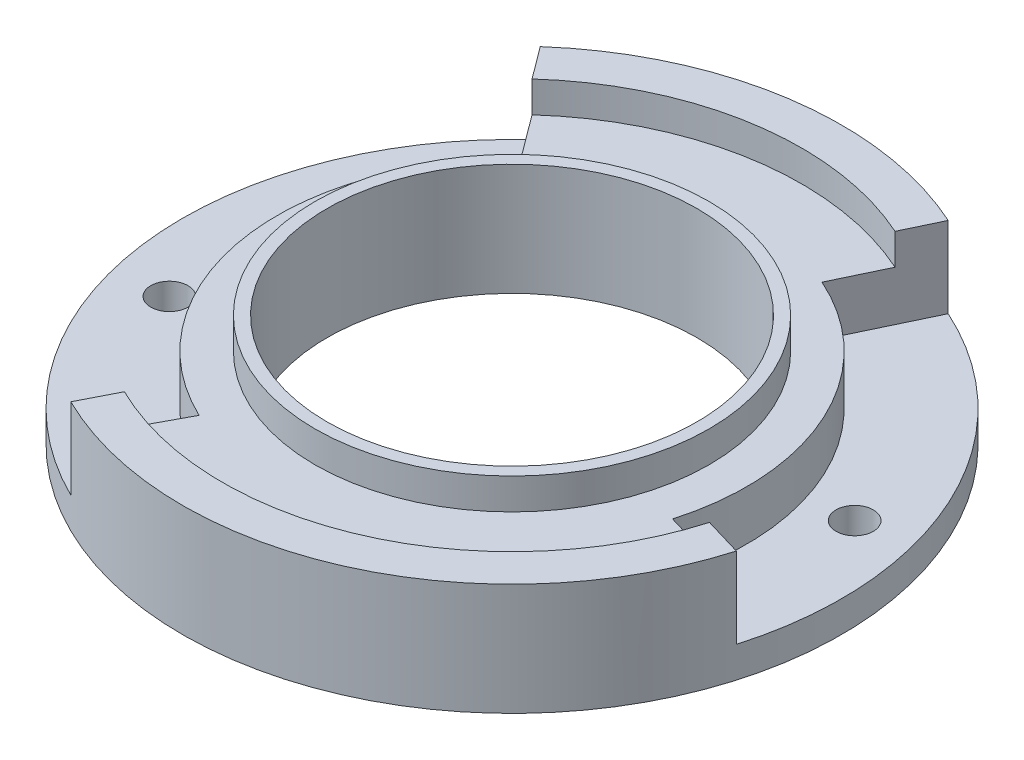
ISO-10303-21;
HEADER;
FILE_DESCRIPTION(('STEP AP214'),'2;1');
FILE_NAME('part.step','',(''),(''),'','','');
FILE_SCHEMA(('AUTOMOTIVE_DESIGN { 1 0 10303 214 1 1 1 1 }'));
ENDSEC;
DATA;
#1=APPLICATION_CONTEXT('core data for automotive mechanical design processes');
#2=APPLICATION_PROTOCOL_DEFINITION('international standard','automotive_design',2000,#1);
#3=PRODUCT_CONTEXT('',#1,'mechanical');
#4=PRODUCT('Part','Part','',(#3));
#5=PRODUCT_RELATED_PRODUCT_CATEGORY('part','',(#4));
#6=PRODUCT_DEFINITION_FORMATION('','',#4);
#7=PRODUCT_DEFINITION_CONTEXT('part definition',#1,'design');
#8=PRODUCT_DEFINITION('design','',#6,#7);
#9=PRODUCT_DEFINITION_SHAPE('','',#8);
#10=(LENGTH_UNIT() NAMED_UNIT(*) SI_UNIT(.MILLI.,.METRE.));
#11=(NAMED_UNIT(*) PLANE_ANGLE_UNIT() SI_UNIT($,.RADIAN.));
#12=(NAMED_UNIT(*) SI_UNIT($,.STERADIAN.) SOLID_ANGLE_UNIT());
#13=UNCERTAINTY_MEASURE_WITH_UNIT(LENGTH_MEASURE(1.E-05),#10,'distance_accuracy_value','');
#14=(GEOMETRIC_REPRESENTATION_CONTEXT(3) GLOBAL_UNCERTAINTY_ASSIGNED_CONTEXT((#13)) GLOBAL_UNIT_ASSIGNED_CONTEXT((#10,
#11,#12)) REPRESENTATION_CONTEXT('',''));
#15=CARTESIAN_POINT('',(0.,0.,0.));
#16=DIRECTION('',(0.,0.,1.));
#17=DIRECTION('',(1.,0.,0.));
#18=AXIS2_PLACEMENT_3D('',#15,#16,#17);
#19=CARTESIAN_POINT('',(0.,-5.,0.));
#20=DIRECTION('',(0.,1.,0.));
#21=DIRECTION('',(0.,0.,1.));
#22=AXIS2_PLACEMENT_3D('',#19,#20,#21);
#23=CYLINDRICAL_SURFACE('',#22,26.5068235865477);
#24=CARTESIAN_POINT('',(0.,-6.5,0.));
#25=DIRECTION('',(0.,1.,0.));
#26=DIRECTION('',(0.,0.,1.));
#27=AXIS2_PLACEMENT_3D('',#24,#25,#26);
#28=CIRCLE('',#27,26.5068235865477);
#29=CARTESIAN_POINT('',(-17.5722624914168,-6.5,-19.8450822014198));
#30=VERTEX_POINT('',#29);
#31=CARTESIAN_POINT('',(-11.7122521251638,-6.5,23.7788739599872));
#32=VERTEX_POINT('',#31);
#33=EDGE_CURVE('E156',#30,#32,#28,.T.);
#34=ORIENTED_EDGE('',*,*,#33,.F.);
#35=DIRECTION('',(0.,1.,0.));
#36=VECTOR('',#35,1.);
#37=CARTESIAN_POINT('',(-17.5722624914168,-5.,-19.8450822014198));
#38=LINE('',#37,#36);
#39=CARTESIAN_POINT('',(-17.5722624914168,0.,-19.8450822014198));
#40=VERTEX_POINT('',#39);
#41=EDGE_CURVE('E219',#30,#40,#38,.T.);
#42=ORIENTED_EDGE('',*,*,#41,.T.);
#43=CARTESIAN_POINT('',(0.,0.,0.));
#44=DIRECTION('',(0.,1.,0.));
#45=DIRECTION('',(0.,0.,1.));
#46=AXIS2_PLACEMENT_3D('',#43,#44,#45);
#47=CIRCLE('',#46,26.5068235865477);
#48=CARTESIAN_POINT('',(10.9409442014473,0.,-24.1434760676498));
#49=VERTEX_POINT('',#48);
#50=EDGE_CURVE('E12',#49,#40,#47,.T.);
#51=ORIENTED_EDGE('',*,*,#50,.F.);
#52=DIRECTION('',(0.,1.,0.));
#53=VECTOR('',#52,1.);
#54=CARTESIAN_POINT('',(10.9409442014473,-5.,-24.1434760676498));
#55=LINE('',#54,#53);
#56=CARTESIAN_POINT('',(10.9409442014473,-6.5,-24.1434760676498));
#57=VERTEX_POINT('',#56);
#58=EDGE_CURVE('E212',#57,#49,#55,.T.);
#59=ORIENTED_EDGE('',*,*,#58,.F.);
#60=CARTESIAN_POINT('',(0.,-6.5,0.));
#61=DIRECTION('',(0.,1.,0.));
#62=DIRECTION('',(0.,0.,1.));
#63=AXIS2_PLACEMENT_3D('',#60,#61,#62);
#64=CIRCLE('',#63,26.5068235865477);
#65=CARTESIAN_POINT('',(25.4508712106212,-6.5,7.40708115715855));
#66=VERTEX_POINT('',#65);
#67=EDGE_CURVE('E184',#66,#57,#64,.T.);
#68=ORIENTED_EDGE('',*,*,#67,.F.);
#69=DIRECTION('',(0.,1.,0.));
#70=VECTOR('',#69,1.);
#71=CARTESIAN_POINT('',(25.4508712106212,-5.,7.40708115715855));
#72=LINE('',#71,#70);
#73=CARTESIAN_POINT('',(25.4508712106212,0.,7.40708115715855));
#74=VERTEX_POINT('',#73);
#75=EDGE_CURVE('E224',#66,#74,#72,.T.);
#76=ORIENTED_EDGE('',*,*,#75,.T.);
#77=CARTESIAN_POINT('',(-11.7122521251638,0.,23.7788739599872));
#78=VERTEX_POINT('',#77);
#79=EDGE_CURVE('E57',#78,#74,#47,.T.);
#80=ORIENTED_EDGE('',*,*,#79,.F.);
#81=DIRECTION('',(0.,1.,0.));
#82=VECTOR('',#81,1.);
#83=CARTESIAN_POINT('',(-11.7122521251638,-5.,23.7788739599872));
#84=LINE('',#83,#82);
#85=CARTESIAN_POINT('',(-11.7122521251638,-2.5,23.7788739599872));
#86=VERTEX_POINT('',#85);
#87=EDGE_CURVE('E64',#86,#78,#84,.T.);
#88=ORIENTED_EDGE('',*,*,#87,.F.);
#89=DIRECTION('',(0.,1.,0.));
#90=VECTOR('',#89,1.);
#91=CARTESIAN_POINT('',(-11.7122521251638,-6.5,23.7788739599872));
#92=LINE('',#91,#90);
#93=EDGE_CURVE('E149',#32,#86,#92,.T.);
#94=ORIENTED_EDGE('',*,*,#93,.F.);
#95=EDGE_LOOP('',(#34,#42,#51,#59,#68,#76,#80,#88,#94));
#96=FACE_BOUND('',#95,.T.);
#97=CARTESIAN_POINT('',(0.,-8.99999999999997,0.));
#98=DIRECTION('',(0.,-1.,0.));
#99=DIRECTION('',(0.,0.,-1.));
#100=AXIS2_PLACEMENT_3D('',#97,#98,#99);
#101=CIRCLE('',#100,26.5068235865477);
#102=CARTESIAN_POINT('',(0.,-8.99999999999997,-26.5068235865477));
#103=VERTEX_POINT('',#102);
#104=EDGE_CURVE('E229',#103,#103,#101,.T.);
#105=ORIENTED_EDGE('',*,*,#104,.F.);
#106=EDGE_LOOP('',(#105));
#107=FACE_BOUND('',#106,.T.);
#108=ADVANCED_FACE('F49',(#96,#107),#23,.T.);
#109=CARTESIAN_POINT('',(0.,0.,0.));
#110=DIRECTION('',(0.,1.,0.));
#111=DIRECTION('',(0.,0.,1.));
#112=AXIS2_PLACEMENT_3D('',#109,#110,#111);
#113=PLANE('',#112);
#114=ORIENTED_EDGE('',*,*,#50,.T.);
#115=DIRECTION('',(0.596577813178409,0.,0.802555239733233));
#116=VECTOR('',#115,1.);
#117=CARTESIAN_POINT('',(-1.81664445380633,0.,1.35039897806251));
#118=LINE('',#117,#116);
#119=CARTESIAN_POINT('',(-15.6511569272339,0.,-17.2606861636233));
#120=VERTEX_POINT('',#119);
#121=EDGE_CURVE('E216',#40,#120,#118,.T.);
#122=ORIENTED_EDGE('',*,*,#121,.T.);
#123=CARTESIAN_POINT('',(0.,0.,0.));
#124=DIRECTION('',(0.,1.,0.));
#125=DIRECTION('',(0.,0.,1.));
#126=AXIS2_PLACEMENT_3D('',#123,#124,#125);
#127=CIRCLE('',#126,23.3);
#128=CARTESIAN_POINT('',(9.5615087764627,0.,-21.2477657629603));
#129=VERTEX_POINT('',#128);
#130=EDGE_CURVE('E245',#129,#120,#127,.T.);
#131=ORIENTED_EDGE('',*,*,#130,.F.);
#132=DIRECTION('',(-0.430067192331692,0.,0.902796881961793));
#133=VECTOR('',#132,1.);
#134=CARTESIAN_POINT('',(-0.45669483860299,0.,-0.217556651905534));
#135=LINE('',#134,#133);
#136=EDGE_CURVE('E210',#49,#129,#135,.T.);
#137=ORIENTED_EDGE('',*,*,#136,.F.);
#138=EDGE_LOOP('',(#114,#122,#131,#137));
#139=FACE_BOUND('',#138,.T.);
#140=ADVANCED_FACE('F298',(#139),#113,.T.);
#141=DIRECTION('',(0.454033364554957,0.,-0.890984682175236));
#142=VECTOR('',#141,1.);
#143=CARTESIAN_POINT('',(0.32161420747133,0.,0.163890113520677));
#144=LINE('',#143,#142);
#145=CARTESIAN_POINT('',(-10.2560936130451,0.,20.9213418260028));
#146=VERTEX_POINT('',#145);
#147=EDGE_CURVE('E68',#78,#146,#144,.T.);
#148=ORIENTED_EDGE('',*,*,#147,.F.);
#149=ORIENTED_EDGE('',*,*,#79,.T.);
#150=DIRECTION('',(-0.958607911681218,0.,-0.28472947101095));
#151=VECTOR('',#150,1.);
#152=CARTESIAN_POINT('',(0.0416065201490512,0.,-0.140078015987571));
#153=LINE('',#152,#151);
#154=CARTESIAN_POINT('',(22.3767316067197,0.,6.49398818915083));
#155=VERTEX_POINT('',#154);
#156=EDGE_CURVE('E221',#74,#155,#153,.T.);
#157=ORIENTED_EDGE('',*,*,#156,.T.);
#158=EDGE_CURVE('E236',#146,#155,#127,.T.);
#159=ORIENTED_EDGE('',*,*,#158,.F.);
#160=EDGE_LOOP('',(#148,#149,#157,#159));
#161=FACE_BOUND('',#160,.T.);
#162=ADVANCED_FACE('F250',(#161),#113,.T.);
#163=CARTESIAN_POINT('',(0.,-2.5,0.));
#164=DIRECTION('',(0.,1.,0.));
#165=DIRECTION('',(0.,0.,1.));
#166=AXIS2_PLACEMENT_3D('',#163,#164,#165);
#167=CYLINDRICAL_SURFACE('',#166,23.3);
#168=DIRECTION('',(0.,1.,0.));
#169=VECTOR('',#168,1.);
#170=CARTESIAN_POINT('',(-15.6511569272339,-2.5,-17.2606861636233));
#171=LINE('',#170,#169);
#172=CARTESIAN_POINT('',(-15.6511569272339,-2.5,-17.2606861636233));
#173=VERTEX_POINT('',#172);
#174=EDGE_CURVE('E214',#173,#120,#171,.T.);
#175=ORIENTED_EDGE('',*,*,#174,.F.);
#176=CARTESIAN_POINT('',(0.,-2.5,0.));
#177=DIRECTION('',(0.,1.,0.));
#178=DIRECTION('',(0.,0.,1.));
#179=AXIS2_PLACEMENT_3D('',#176,#177,#178);
#180=CIRCLE('',#179,23.3);
#181=CARTESIAN_POINT('',(9.5615087764627,-2.5,-21.2477657629603));
#182=VERTEX_POINT('',#181);
#183=EDGE_CURVE('E241',#182,#173,#180,.T.);
#184=ORIENTED_EDGE('',*,*,#183,.F.);
#185=DIRECTION('',(0.,1.,0.));
#186=VECTOR('',#185,1.);
#187=CARTESIAN_POINT('',(9.5615087764627,-2.5,-21.2477657629603));
#188=LINE('',#187,#186);
#189=EDGE_CURVE('E207',#182,#129,#188,.T.);
#190=ORIENTED_EDGE('',*,*,#189,.T.);
#191=ORIENTED_EDGE('',*,*,#130,.T.);
#192=EDGE_LOOP('',(#175,#184,#190,#191));
#193=FACE_BOUND('',#192,.T.);
#194=ADVANCED_FACE('F294',(#193),#167,.F.);
#195=CARTESIAN_POINT('',(-10.2560936130451,-2.5,20.9213418260028));
#196=VERTEX_POINT('',#195);
#197=CARTESIAN_POINT('',(-10.194983168781,-2.5,20.9511889445032));
#198=VERTEX_POINT('',#197);
#199=EDGE_CURVE('E239',#196,#198,#180,.T.);
#200=ORIENTED_EDGE('',*,*,#199,.F.);
#201=DIRECTION('',(0.,-1.,0.));
#202=VECTOR('',#201,1.);
#203=CARTESIAN_POINT('',(-10.2560936130451,20.5,20.9213418260028));
#204=LINE('',#203,#202);
#205=EDGE_CURVE('E205',#146,#196,#204,.T.);
#206=ORIENTED_EDGE('',*,*,#205,.F.);
#207=ORIENTED_EDGE('',*,*,#158,.T.);
#208=DIRECTION('',(0.,-1.,0.));
#209=VECTOR('',#208,1.);
#210=CARTESIAN_POINT('',(22.3767316067197,20.5,6.49398818915083));
#211=LINE('',#210,#209);
#212=CARTESIAN_POINT('',(22.3767316067197,-2.5,6.49398818915083));
#213=VERTEX_POINT('',#212);
#214=EDGE_CURVE('E202',#155,#213,#211,.T.);
#215=ORIENTED_EDGE('',*,*,#214,.T.);
#216=EDGE_CURVE('E242',#198,#213,#180,.T.);
#217=ORIENTED_EDGE('',*,*,#216,.F.);
#218=EDGE_LOOP('',(#200,#206,#207,#215,#217));
#219=FACE_BOUND('',#218,.T.);
#220=ADVANCED_FACE('F274',(#219),#167,.F.);
#221=CARTESIAN_POINT('',(0.,0.,0.));
#222=DIRECTION('',(0.,1.,0.));
#223=DIRECTION('',(0.,0.,1.));
#224=AXIS2_PLACEMENT_3D('',#221,#222,#223);
#225=CIRCLE('',#224,14.875);
#226=CARTESIAN_POINT('',(0.,0.,14.875));
#227=VERTEX_POINT('',#226);
#228=EDGE_CURVE('E246',#227,#227,#225,.T.);
#229=ORIENTED_EDGE('',*,*,#228,.F.);
#230=EDGE_LOOP('',(#229));
#231=FACE_BOUND('',#230,.T.);
#232=CARTESIAN_POINT('',(0.,0.,0.));
#233=DIRECTION('',(0.,1.,0.));
#234=DIRECTION('',(0.,0.,1.));
#235=AXIS2_PLACEMENT_3D('',#232,#233,#234);
#236=CIRCLE('',#235,15.85);
#237=CARTESIAN_POINT('',(0.,0.,15.85));
#238=VERTEX_POINT('',#237);
#239=EDGE_CURVE('E232',#238,#238,#236,.T.);
#240=ORIENTED_EDGE('',*,*,#239,.T.);
#241=EDGE_LOOP('',(#240));
#242=FACE_BOUND('',#241,.T.);
#243=ADVANCED_FACE('F322',(#231,#242),#113,.T.);
#244=CARTESIAN_POINT('',(0.,-5.,0.));
#245=DIRECTION('',(0.,1.,0.));
#246=DIRECTION('',(0.,0.,1.));
#247=AXIS2_PLACEMENT_3D('',#244,#245,#246);
#248=CYLINDRICAL_SURFACE('',#247,14.875);
#249=ORIENTED_EDGE('',*,*,#228,.T.);
#250=EDGE_LOOP('',(#249));
#251=FACE_BOUND('',#250,.T.);
#252=CARTESIAN_POINT('',(0.,-8.99999999999997,0.));
#253=DIRECTION('',(0.,-1.,0.));
#254=DIRECTION('',(0.,0.,-1.));
#255=AXIS2_PLACEMENT_3D('',#252,#253,#254);
#256=CIRCLE('',#255,14.875);
#257=CARTESIAN_POINT('',(0.,-8.99999999999997,-14.875));
#258=VERTEX_POINT('',#257);
#259=EDGE_CURVE('E52',#258,#258,#256,.T.);
#260=ORIENTED_EDGE('',*,*,#259,.T.);
#261=EDGE_LOOP('',(#260));
#262=FACE_BOUND('',#261,.T.);
#263=ADVANCED_FACE('F328',(#251,#262),#248,.F.);
#264=CARTESIAN_POINT('',(0.,-2.5,0.));
#265=DIRECTION('',(0.,1.,0.));
#266=DIRECTION('',(0.,0.,1.));
#267=AXIS2_PLACEMENT_3D('',#264,#265,#266);
#268=PLANE('',#267);
#269=DIRECTION('',(-0.59657781317841,0.,-0.802555239733233));
#270=VECTOR('',#269,1.);
#271=CARTESIAN_POINT('',(-17.5722624914168,-2.5,-19.8450822014198));
#272=LINE('',#271,#270);
#273=CARTESIAN_POINT('',(-13.0056356006535,-2.5,-13.7017589699326));
#274=VERTEX_POINT('',#273);
#275=EDGE_CURVE('E165',#274,#173,#272,.T.);
#276=ORIENTED_EDGE('',*,*,#275,.F.);
#277=CARTESIAN_POINT('',(0.,-2.5,0.));
#278=DIRECTION('',(0.,-1.,0.));
#279=DIRECTION('',(0.,0.,1.));
#280=AXIS2_PLACEMENT_3D('',#277,#278,#279);
#281=CIRCLE('',#280,18.8913937084355);
#282=CARTESIAN_POINT('',(-8.10852517133059,-2.5,17.062724747033));
#283=VERTEX_POINT('',#282);
#284=EDGE_CURVE('E279',#283,#274,#281,.T.);
#285=ORIENTED_EDGE('',*,*,#284,.F.);
#286=DIRECTION('',(0.472811548932767,0.,-0.881163571191977));
#287=VECTOR('',#286,1.);
#288=CARTESIAN_POINT('',(-8.10852517133058,-2.5,17.062724747033));
#289=LINE('',#288,#287);
#290=EDGE_CURVE('E189',#198,#283,#289,.T.);
#291=ORIENTED_EDGE('',*,*,#290,.F.);
#292=ORIENTED_EDGE('',*,*,#216,.T.);
#293=DIRECTION('',(0.958607911681217,0.,0.28472947101095));
#294=VECTOR('',#293,1.);
#295=CARTESIAN_POINT('',(18.1505042261017,-2.5,5.23869760392609));
#296=LINE('',#295,#294);
#297=CARTESIAN_POINT('',(18.1505042261017,-2.5,5.23869760392609));
#298=VERTEX_POINT('',#297);
#299=EDGE_CURVE('E181',#298,#213,#296,.T.);
#300=ORIENTED_EDGE('',*,*,#299,.F.);
#301=CARTESIAN_POINT('',(0.,-2.5,0.));
#302=DIRECTION('',(0.,-1.,0.));
#303=DIRECTION('',(0.,0.,1.));
#304=AXIS2_PLACEMENT_3D('',#301,#302,#303);
#305=CIRCLE('',#304,18.8913937084355);
#306=CARTESIAN_POINT('',(7.6649604652645,-2.5,-17.266532289752));
#307=VERTEX_POINT('',#306);
#308=EDGE_CURVE('E183',#307,#298,#305,.T.);
#309=ORIENTED_EDGE('',*,*,#308,.F.);
#310=DIRECTION('',(-0.430067192331692,0.,0.902796881961793));
#311=VECTOR('',#310,1.);
#312=CARTESIAN_POINT('',(10.9409442014473,-2.5,-24.1434760676498));
#313=LINE('',#312,#311);
#314=EDGE_CURVE('E187',#182,#307,#313,.T.);
#315=ORIENTED_EDGE('',*,*,#314,.F.);
#316=ORIENTED_EDGE('',*,*,#183,.T.);
#317=EDGE_LOOP('',(#276,#285,#291,#292,#300,#309,#315,#316));
#318=FACE_BOUND('',#317,.T.);
#319=CARTESIAN_POINT('',(0.,-2.5,0.));
#320=DIRECTION('',(0.,1.,0.));
#321=DIRECTION('',(0.,0.,1.));
#322=AXIS2_PLACEMENT_3D('',#319,#320,#321);
#323=CIRCLE('',#322,15.85);
#324=CARTESIAN_POINT('',(0.,-2.5,15.85));
#325=VERTEX_POINT('',#324);
#326=EDGE_CURVE('E233',#325,#325,#323,.T.);
#327=ORIENTED_EDGE('',*,*,#326,.F.);
#328=EDGE_LOOP('',(#327));
#329=FACE_BOUND('',#328,.T.);
#330=ADVANCED_FACE('F269',(#318,#329),#268,.T.);
#331=CARTESIAN_POINT('',(0.,-2.5,0.));
#332=DIRECTION('',(0.,1.,0.));
#333=DIRECTION('',(0.,0.,1.));
#334=AXIS2_PLACEMENT_3D('',#331,#332,#333);
#335=CYLINDRICAL_SURFACE('',#334,15.85);
#336=ORIENTED_EDGE('',*,*,#326,.T.);
#337=EDGE_LOOP('',(#336));
#338=FACE_BOUND('',#337,.T.);
#339=ORIENTED_EDGE('',*,*,#239,.F.);
#340=EDGE_LOOP('',(#339));
#341=FACE_BOUND('',#340,.T.);
#342=ADVANCED_FACE('F312',(#338,#341),#335,.T.);
#343=CARTESIAN_POINT('',(0.,-8.99999999999997,0.));
#344=DIRECTION('',(0.,-1.,0.));
#345=DIRECTION('',(0.,0.,-1.));
#346=AXIS2_PLACEMENT_3D('',#343,#344,#345);
#347=PLANE('',#346);
#348=CARTESIAN_POINT('',(-21.5892349645166,-9.,5.97201252903037));
#349=DIRECTION('',(0.,1.,0.));
#350=DIRECTION('',(0.,0.,1.));
#351=AXIS2_PLACEMENT_3D('',#348,#349,#350);
#352=CIRCLE('',#351,1.5);
#353=CARTESIAN_POINT('',(-21.5892349645166,-9.,7.47201252903037));
#354=VERTEX_POINT('',#353);
#355=EDGE_CURVE('E478',#354,#354,#352,.T.);
#356=ORIENTED_EDGE('',*,*,#355,.T.);
#357=EDGE_LOOP('',(#356));
#358=FACE_BOUND('',#357,.T.);
#359=CARTESIAN_POINT('',(21.5892349645165,-9.,-5.97201252903037));
#360=DIRECTION('',(0.,1.,0.));
#361=DIRECTION('',(0.,0.,1.));
#362=AXIS2_PLACEMENT_3D('',#359,#360,#361);
#363=CIRCLE('',#362,1.5);
#364=CARTESIAN_POINT('',(21.5892349645165,-9.,-4.47201252903038));
#365=VERTEX_POINT('',#364);
#366=EDGE_CURVE('E488',#365,#365,#363,.T.);
#367=ORIENTED_EDGE('',*,*,#366,.T.);
#368=EDGE_LOOP('',(#367));
#369=FACE_BOUND('',#368,.T.);
#370=ORIENTED_EDGE('',*,*,#259,.F.);
#371=EDGE_LOOP('',(#370));
#372=FACE_BOUND('',#371,.T.);
#373=ORIENTED_EDGE('',*,*,#104,.T.);
#374=EDGE_LOOP('',(#373));
#375=FACE_BOUND('',#374,.T.);
#376=ADVANCED_FACE('F304',(#358,#369,#372,#375),#347,.T.);
#377=CARTESIAN_POINT('',(-0.45669483860299,20.5,-0.217556651905534));
#378=DIRECTION('',(-0.902796881961793,0.,-0.430067192331692));
#379=DIRECTION('',(-0.430067192331692,0.,0.902796881961793));
#380=AXIS2_PLACEMENT_3D('',#377,#378,#379);
#381=PLANE('',#380);
#382=ORIENTED_EDGE('',*,*,#58,.T.);
#383=ORIENTED_EDGE('',*,*,#136,.T.);
#384=ORIENTED_EDGE('',*,*,#189,.F.);
#385=ORIENTED_EDGE('',*,*,#314,.T.);
#386=DIRECTION('',(0.,1.,0.));
#387=VECTOR('',#386,1.);
#388=CARTESIAN_POINT('',(7.6649604652645,-6.5,-17.266532289752));
#389=LINE('',#388,#387);
#390=CARTESIAN_POINT('',(7.6649604652645,-6.5,-17.266532289752));
#391=VERTEX_POINT('',#390);
#392=EDGE_CURVE('E175',#391,#307,#389,.T.);
#393=ORIENTED_EDGE('',*,*,#392,.F.);
#394=DIRECTION('',(-0.430067192331692,0.,0.902796881961793));
#395=VECTOR('',#394,1.);
#396=CARTESIAN_POINT('',(10.9409442014473,-6.5,-24.1434760676498));
#397=LINE('',#396,#395);
#398=EDGE_CURVE('E195',#57,#391,#397,.T.);
#399=ORIENTED_EDGE('',*,*,#398,.F.);
#400=EDGE_LOOP('',(#382,#383,#384,#385,#393,#399));
#401=FACE_BOUND('',#400,.T.);
#402=ADVANCED_FACE('F302',(#401),#381,.F.);
#403=CARTESIAN_POINT('',(0.0416065201490512,20.5,-0.140078015987571));
#404=DIRECTION('',(0.28472947101095,0.,-0.958607911681218));
#405=DIRECTION('',(-0.958607911681218,0.,-0.28472947101095));
#406=AXIS2_PLACEMENT_3D('',#403,#404,#405);
#407=PLANE('',#406);
#408=ORIENTED_EDGE('',*,*,#75,.F.);
#409=DIRECTION('',(0.958607911681217,0.,0.28472947101095));
#410=VECTOR('',#409,1.);
#411=CARTESIAN_POINT('',(18.1505042261017,-6.5,5.23869760392609));
#412=LINE('',#411,#410);
#413=CARTESIAN_POINT('',(18.1505042261017,-6.5,5.23869760392609));
#414=VERTEX_POINT('',#413);
#415=EDGE_CURVE('E178',#414,#66,#412,.T.);
#416=ORIENTED_EDGE('',*,*,#415,.F.);
#417=DIRECTION('',(0.,1.,0.));
#418=VECTOR('',#417,1.);
#419=CARTESIAN_POINT('',(18.1505042261017,-6.5,5.23869760392609));
#420=LINE('',#419,#418);
#421=EDGE_CURVE('E179',#414,#298,#420,.T.);
#422=ORIENTED_EDGE('',*,*,#421,.T.);
#423=ORIENTED_EDGE('',*,*,#299,.T.);
#424=ORIENTED_EDGE('',*,*,#214,.F.);
#425=ORIENTED_EDGE('',*,*,#156,.F.);
#426=EDGE_LOOP('',(#408,#416,#422,#423,#424,#425));
#427=FACE_BOUND('',#426,.T.);
#428=ADVANCED_FACE('F255',(#427),#407,.T.);
#429=CARTESIAN_POINT('',(-1.81664445380633,20.5,1.35039897806251));
#430=DIRECTION('',(-0.802555239733233,0.,0.596577813178409));
#431=DIRECTION('',(0.596577813178409,0.,0.802555239733233));
#432=AXIS2_PLACEMENT_3D('',#429,#430,#431);
#433=PLANE('',#432);
#434=ORIENTED_EDGE('',*,*,#41,.F.);
#435=DIRECTION('',(-0.59657781317841,0.,-0.802555239733233));
#436=VECTOR('',#435,1.);
#437=CARTESIAN_POINT('',(-17.5722624914168,-6.5,-19.8450822014198));
#438=LINE('',#437,#436);
#439=CARTESIAN_POINT('',(-13.0056356006535,-6.5,-13.7017589699326));
#440=VERTEX_POINT('',#439);
#441=EDGE_CURVE('E162',#440,#30,#438,.T.);
#442=ORIENTED_EDGE('',*,*,#441,.F.);
#443=DIRECTION('',(0.,1.,0.));
#444=VECTOR('',#443,1.);
#445=CARTESIAN_POINT('',(-13.0056356006535,-6.5,-13.7017589699326));
#446=LINE('',#445,#444);
#447=EDGE_CURVE('E170',#440,#274,#446,.T.);
#448=ORIENTED_EDGE('',*,*,#447,.T.);
#449=ORIENTED_EDGE('',*,*,#275,.T.);
#450=ORIENTED_EDGE('',*,*,#174,.T.);
#451=ORIENTED_EDGE('',*,*,#121,.F.);
#452=EDGE_LOOP('',(#434,#442,#448,#449,#450,#451));
#453=FACE_BOUND('',#452,.T.);
#454=ADVANCED_FACE('F286',(#453),#433,.T.);
#455=CARTESIAN_POINT('',(0.32161420747133,20.5,0.163890113520677));
#456=DIRECTION('',(0.890984682175235,0.,0.454033364554957));
#457=DIRECTION('',(0.454033364554957,0.,-0.890984682175236));
#458=AXIS2_PLACEMENT_3D('',#455,#456,#457);
#459=PLANE('',#458);
#460=ORIENTED_EDGE('',*,*,#87,.T.);
#461=ORIENTED_EDGE('',*,*,#147,.T.);
#462=ORIENTED_EDGE('',*,*,#205,.T.);
#463=DIRECTION('',(-0.454033364554957,0.,0.890984682175236));
#464=VECTOR('',#463,1.);
#465=CARTESIAN_POINT('',(0.32161420747133,-2.5,0.163890113520677));
#466=LINE('',#465,#464);
#467=EDGE_CURVE('E200',#196,#86,#466,.T.);
#468=ORIENTED_EDGE('',*,*,#467,.T.);
#469=EDGE_LOOP('',(#460,#461,#462,#468));
#470=FACE_BOUND('',#469,.T.);
#471=ADVANCED_FACE('F275',(#470),#459,.F.);
#472=CARTESIAN_POINT('',(0.,-2.5,0.));
#473=DIRECTION('',(0.,1.,0.));
#474=DIRECTION('',(0.,0.,1.));
#475=AXIS2_PLACEMENT_3D('',#472,#473,#474);
#476=PLANE('',#475);
#477=EDGE_CURVE('E278',#86,#198,#289,.T.);
#478=ORIENTED_EDGE('',*,*,#477,.F.);
#479=ORIENTED_EDGE('',*,*,#467,.F.);
#480=ORIENTED_EDGE('',*,*,#199,.T.);
#481=EDGE_LOOP('',(#478,#479,#480));
#482=FACE_BOUND('',#481,.T.);
#483=ADVANCED_FACE('F277',(#482),#476,.F.);
#484=CARTESIAN_POINT('',(0.,-6.5,0.));
#485=DIRECTION('',(0.,1.,0.));
#486=DIRECTION('',(0.,0.,1.));
#487=AXIS2_PLACEMENT_3D('',#484,#485,#486);
#488=CYLINDRICAL_SURFACE('',#487,18.8913937084355);
#489=ORIENTED_EDGE('',*,*,#284,.T.);
#490=ORIENTED_EDGE('',*,*,#447,.F.);
#491=CARTESIAN_POINT('',(0.,-6.5,0.));
#492=DIRECTION('',(0.,-1.,0.));
#493=DIRECTION('',(0.,0.,1.));
#494=AXIS2_PLACEMENT_3D('',#491,#492,#493);
#495=CIRCLE('',#494,18.8913937084355);
#496=CARTESIAN_POINT('',(-8.10852517133059,-6.5,17.062724747033));
#497=VERTEX_POINT('',#496);
#498=EDGE_CURVE('E155',#497,#440,#495,.T.);
#499=ORIENTED_EDGE('',*,*,#498,.F.);
#500=DIRECTION('',(0.,1.,0.));
#501=VECTOR('',#500,1.);
#502=CARTESIAN_POINT('',(-8.10852517133059,-6.5,17.062724747033));
#503=LINE('',#502,#501);
#504=EDGE_CURVE('E151',#497,#283,#503,.T.);
#505=ORIENTED_EDGE('',*,*,#504,.T.);
#506=EDGE_LOOP('',(#489,#490,#499,#505));
#507=FACE_BOUND('',#506,.T.);
#508=ADVANCED_FACE('F289',(#507),#488,.T.);
#509=CARTESIAN_POINT('',(-8.10852517133058,-6.5,17.062724747033));
#510=DIRECTION('',(0.881163571191977,0.,0.472811548932767));
#511=DIRECTION('',(0.472811548932767,0.,-0.881163571191977));
#512=AXIS2_PLACEMENT_3D('',#509,#510,#511);
#513=PLANE('',#512);
#514=ORIENTED_EDGE('',*,*,#477,.T.);
#515=ORIENTED_EDGE('',*,*,#290,.T.);
#516=ORIENTED_EDGE('',*,*,#504,.F.);
#517=DIRECTION('',(0.472811548932767,0.,-0.881163571191977));
#518=VECTOR('',#517,1.);
#519=CARTESIAN_POINT('',(-8.10852517133058,-6.5,17.062724747033));
#520=LINE('',#519,#518);
#521=EDGE_CURVE('E144',#32,#497,#520,.T.);
#522=ORIENTED_EDGE('',*,*,#521,.F.);
#523=ORIENTED_EDGE('',*,*,#93,.T.);
#524=EDGE_LOOP('',(#514,#515,#516,#522,#523));
#525=FACE_BOUND('',#524,.T.);
#526=ADVANCED_FACE('F147',(#525),#513,.F.);
#527=CARTESIAN_POINT('',(0.,-6.5,0.));
#528=DIRECTION('',(0.,1.,0.));
#529=DIRECTION('',(0.,0.,1.));
#530=AXIS2_PLACEMENT_3D('',#527,#528,#529);
#531=PLANE('',#530);
#532=CARTESIAN_POINT('',(-21.5892349645166,-6.5,5.97201252903037));
#533=DIRECTION('',(0.,1.,0.));
#534=DIRECTION('',(0.,0.,1.));
#535=AXIS2_PLACEMENT_3D('',#532,#533,#534);
#536=CIRCLE('',#535,1.5);
#537=CARTESIAN_POINT('',(-21.5892349645166,-6.5,7.47201252903037));
#538=VERTEX_POINT('',#537);
#539=EDGE_CURVE('E481',#538,#538,#536,.T.);
#540=ORIENTED_EDGE('',*,*,#539,.F.);
#541=EDGE_LOOP('',(#540));
#542=FACE_BOUND('',#541,.T.);
#543=ORIENTED_EDGE('',*,*,#33,.T.);
#544=ORIENTED_EDGE('',*,*,#521,.T.);
#545=ORIENTED_EDGE('',*,*,#498,.T.);
#546=ORIENTED_EDGE('',*,*,#441,.T.);
#547=EDGE_LOOP('',(#543,#544,#545,#546));
#548=FACE_BOUND('',#547,.T.);
#549=ADVANCED_FACE('F160',(#542,#548),#531,.T.);
#550=CARTESIAN_POINT('',(0.,-6.5,0.));
#551=DIRECTION('',(0.,1.,0.));
#552=DIRECTION('',(0.,0.,1.));
#553=AXIS2_PLACEMENT_3D('',#550,#551,#552);
#554=CYLINDRICAL_SURFACE('',#553,18.8913937084355);
#555=ORIENTED_EDGE('',*,*,#308,.T.);
#556=ORIENTED_EDGE('',*,*,#421,.F.);
#557=CARTESIAN_POINT('',(0.,-6.5,0.));
#558=DIRECTION('',(0.,-1.,0.));
#559=DIRECTION('',(0.,0.,1.));
#560=AXIS2_PLACEMENT_3D('',#557,#558,#559);
#561=CIRCLE('',#560,18.8913937084355);
#562=EDGE_CURVE('E192',#391,#414,#561,.T.);
#563=ORIENTED_EDGE('',*,*,#562,.F.);
#564=ORIENTED_EDGE('',*,*,#392,.T.);
#565=EDGE_LOOP('',(#555,#556,#563,#564));
#566=FACE_BOUND('',#565,.T.);
#567=ADVANCED_FACE('F261',(#566),#554,.T.);
#568=CARTESIAN_POINT('',(0.,-6.5,0.));
#569=DIRECTION('',(0.,1.,0.));
#570=DIRECTION('',(0.,0.,1.));
#571=AXIS2_PLACEMENT_3D('',#568,#569,#570);
#572=PLANE('',#571);
#573=CARTESIAN_POINT('',(21.5892349645165,-6.5,-5.97201252903037));
#574=DIRECTION('',(0.,1.,0.));
#575=DIRECTION('',(0.,0.,1.));
#576=AXIS2_PLACEMENT_3D('',#573,#574,#575);
#577=CIRCLE('',#576,1.5);
#578=CARTESIAN_POINT('',(21.5892349645165,-6.5,-4.47201252903038));
#579=VERTEX_POINT('',#578);
#580=EDGE_CURVE('E483',#579,#579,#577,.T.);
#581=ORIENTED_EDGE('',*,*,#580,.F.);
#582=EDGE_LOOP('',(#581));
#583=FACE_BOUND('',#582,.T.);
#584=ORIENTED_EDGE('',*,*,#67,.T.);
#585=ORIENTED_EDGE('',*,*,#398,.T.);
#586=ORIENTED_EDGE('',*,*,#562,.T.);
#587=ORIENTED_EDGE('',*,*,#415,.T.);
#588=EDGE_LOOP('',(#584,#585,#586,#587));
#589=FACE_BOUND('',#588,.T.);
#590=ADVANCED_FACE('F257',(#583,#589),#572,.T.);
#591=CARTESIAN_POINT('',(21.5892349645165,-6.5,-5.97201252903037));
#592=DIRECTION('',(0.,1.,0.));
#593=DIRECTION('',(0.,0.,1.));
#594=AXIS2_PLACEMENT_3D('',#591,#592,#593);
#595=CYLINDRICAL_SURFACE('',#594,1.5);
#596=ORIENTED_EDGE('',*,*,#366,.F.);
#597=EDGE_LOOP('',(#596));
#598=FACE_BOUND('',#597,.T.);
#599=ORIENTED_EDGE('',*,*,#580,.T.);
#600=EDGE_LOOP('',(#599));
#601=FACE_BOUND('',#600,.T.);
#602=ADVANCED_FACE('F447',(#598,#601),#595,.F.);
#603=CARTESIAN_POINT('',(-21.5892349645166,-6.5,5.97201252903037));
#604=DIRECTION('',(0.,1.,0.));
#605=DIRECTION('',(0.,0.,1.));
#606=AXIS2_PLACEMENT_3D('',#603,#604,#605);
#607=CYLINDRICAL_SURFACE('',#606,1.5);
#608=ORIENTED_EDGE('',*,*,#355,.F.);
#609=EDGE_LOOP('',(#608));
#610=FACE_BOUND('',#609,.T.);
#611=ORIENTED_EDGE('',*,*,#539,.T.);
#612=EDGE_LOOP('',(#611));
#613=FACE_BOUND('',#612,.T.);
#614=ADVANCED_FACE('F454',(#610,#613),#607,.F.);
#615=CLOSED_SHELL('',(#108,#140,#162,#194,#220,#243,#263,#330,#342,#376,#402,#428,#454,#471,
#483,#508,#526,#549,#567,#590,#602,#614));
#616=MANIFOLD_SOLID_BREP('B2',#615);
#617=ADVANCED_BREP_SHAPE_REPRESENTATION('',(#18,#616),#14);
#618=SHAPE_DEFINITION_REPRESENTATION(#9,#617);
ENDSEC;
END-ISO-10303-21;
